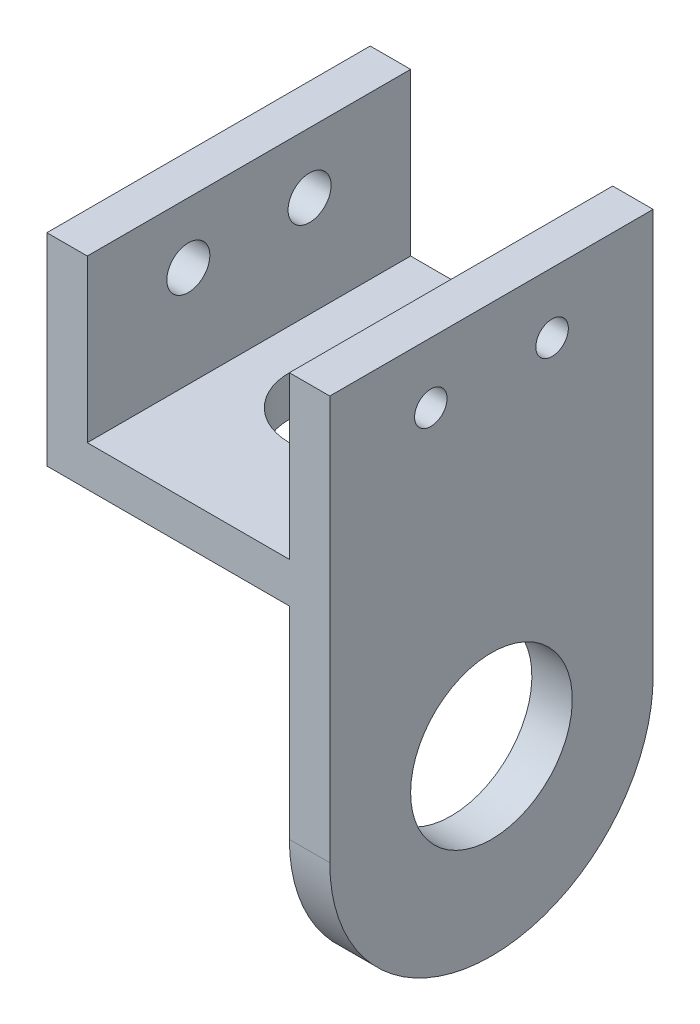
ISO-10303-21;
HEADER;
FILE_DESCRIPTION(('STEP AP214'),'2;1');
FILE_NAME('part.step','',(''),(''),'','','');
FILE_SCHEMA(('AUTOMOTIVE_DESIGN { 1 0 10303 214 1 1 1 1 }'));
ENDSEC;
DATA;
#1=APPLICATION_CONTEXT('core data for automotive mechanical design processes');
#2=APPLICATION_PROTOCOL_DEFINITION('international standard','automotive_design',2000,#1);
#3=PRODUCT_CONTEXT('',#1,'mechanical');
#4=PRODUCT('Part','Part','',(#3));
#5=PRODUCT_RELATED_PRODUCT_CATEGORY('part','',(#4));
#6=PRODUCT_DEFINITION_FORMATION('','',#4);
#7=PRODUCT_DEFINITION_CONTEXT('part definition',#1,'design');
#8=PRODUCT_DEFINITION('design','',#6,#7);
#9=PRODUCT_DEFINITION_SHAPE('','',#8);
#10=(LENGTH_UNIT() NAMED_UNIT(*) SI_UNIT(.MILLI.,.METRE.));
#11=(NAMED_UNIT(*) PLANE_ANGLE_UNIT() SI_UNIT($,.RADIAN.));
#12=(NAMED_UNIT(*) SI_UNIT($,.STERADIAN.) SOLID_ANGLE_UNIT());
#13=UNCERTAINTY_MEASURE_WITH_UNIT(LENGTH_MEASURE(1.E-05),#10,'distance_accuracy_value','');
#14=(GEOMETRIC_REPRESENTATION_CONTEXT(3) GLOBAL_UNCERTAINTY_ASSIGNED_CONTEXT((#13)) GLOBAL_UNIT_ASSIGNED_CONTEXT((#10,
#11,#12)) REPRESENTATION_CONTEXT('',''));
#15=CARTESIAN_POINT('',(0.,0.,0.));
#16=DIRECTION('',(0.,0.,1.));
#17=DIRECTION('',(1.,0.,0.));
#18=AXIS2_PLACEMENT_3D('',#15,#16,#17);
#19=CARTESIAN_POINT('',(0.,25.4,25.4));
#20=DIRECTION('',(1.,0.,0.));
#21=DIRECTION('',(0.,0.,-1.));
#22=AXIS2_PLACEMENT_3D('',#19,#20,#21);
#23=CYLINDRICAL_SURFACE('',#22,25.4);
#24=DIRECTION('',(-1.,0.,0.));
#25=VECTOR('',#24,1.);
#26=CARTESIAN_POINT('',(0.,25.4,50.8));
#27=LINE('',#26,#25);
#28=CARTESIAN_POINT('',(0.,25.4,50.8));
#29=VERTEX_POINT('',#28);
#30=CARTESIAN_POINT('',(6.35,25.4,50.8));
#31=VERTEX_POINT('',#30);
#32=EDGE_CURVE('E125',#29,#31,#27,.F.);
#33=ORIENTED_EDGE('',*,*,#32,.F.);
#34=CARTESIAN_POINT('',(0.,25.4,25.4));
#35=DIRECTION('',(1.,0.,0.));
#36=DIRECTION('',(0.,1.,0.));
#37=AXIS2_PLACEMENT_3D('',#34,#35,#36);
#38=CIRCLE('',#37,25.4);
#39=CARTESIAN_POINT('',(0.,25.4,0.));
#40=VERTEX_POINT('',#39);
#41=EDGE_CURVE('E53',#40,#29,#38,.F.);
#42=ORIENTED_EDGE('',*,*,#41,.F.);
#43=DIRECTION('',(1.,0.,0.));
#44=VECTOR('',#43,1.);
#45=CARTESIAN_POINT('',(0.,25.4,0.));
#46=LINE('',#45,#44);
#47=CARTESIAN_POINT('',(6.35,25.4,0.));
#48=VERTEX_POINT('',#47);
#49=EDGE_CURVE('E202',#48,#40,#46,.F.);
#50=ORIENTED_EDGE('',*,*,#49,.F.);
#51=CARTESIAN_POINT('',(6.35,25.4,25.4));
#52=DIRECTION('',(-1.,0.,0.));
#53=DIRECTION('',(0.,0.,1.));
#54=AXIS2_PLACEMENT_3D('',#51,#52,#53);
#55=CIRCLE('',#54,25.4);
#56=EDGE_CURVE('E11',#31,#48,#55,.F.);
#57=ORIENTED_EDGE('',*,*,#56,.F.);
#58=EDGE_LOOP('',(#33,#42,#50,#57));
#59=FACE_BOUND('',#58,.T.);
#60=ADVANCED_FACE('F45',(#59),#23,.T.);
#61=CARTESIAN_POINT('',(0.,57.15,50.8));
#62=DIRECTION('',(1.,0.,0.));
#63=DIRECTION('',(0.,1.,0.));
#64=AXIS2_PLACEMENT_3D('',#61,#62,#63);
#65=PLANE('',#64);
#66=CARTESIAN_POINT('',(0.,28.575,25.4));
#67=DIRECTION('',(-1.,0.,0.));
#68=DIRECTION('',(0.,-1.,0.));
#69=AXIS2_PLACEMENT_3D('',#66,#67,#68);
#70=CIRCLE('',#69,12.7);
#71=CARTESIAN_POINT('',(0.,15.875,25.4));
#72=VERTEX_POINT('',#71);
#73=EDGE_CURVE('E195',#72,#72,#70,.T.);
#74=ORIENTED_EDGE('',*,*,#73,.F.);
#75=EDGE_LOOP('',(#74));
#76=FACE_BOUND('',#75,.T.);
#77=DIRECTION('',(0.,-1.,0.));
#78=VECTOR('',#77,1.);
#79=CARTESIAN_POINT('',(0.,57.15,0.));
#80=LINE('',#79,#78);
#81=CARTESIAN_POINT('',(0.,57.15,0.));
#82=VERTEX_POINT('',#81);
#83=EDGE_CURVE('E156',#82,#40,#80,.T.);
#84=ORIENTED_EDGE('',*,*,#83,.T.);
#85=ORIENTED_EDGE('',*,*,#41,.T.);
#86=DIRECTION('',(0.,-1.,0.));
#87=VECTOR('',#86,1.);
#88=CARTESIAN_POINT('',(0.,57.15,50.8));
#89=LINE('',#88,#87);
#90=CARTESIAN_POINT('',(0.,57.15,50.8));
#91=VERTEX_POINT('',#90);
#92=EDGE_CURVE('E126',#91,#29,#89,.T.);
#93=ORIENTED_EDGE('',*,*,#92,.F.);
#94=DIRECTION('',(0.,0.,-1.));
#95=VECTOR('',#94,1.);
#96=CARTESIAN_POINT('',(0.,57.15,50.8));
#97=LINE('',#96,#95);
#98=EDGE_CURVE('E155',#91,#82,#97,.T.);
#99=ORIENTED_EDGE('',*,*,#98,.T.);
#100=EDGE_LOOP('',(#84,#85,#93,#99));
#101=FACE_BOUND('',#100,.T.);
#102=ADVANCED_FACE('F205',(#76,#101),#65,.F.);
#103=CARTESIAN_POINT('',(6.35,0.,50.8));
#104=DIRECTION('',(-1.,0.,0.));
#105=DIRECTION('',(0.,0.,1.));
#106=AXIS2_PLACEMENT_3D('',#103,#104,#105);
#107=PLANE('',#106);
#108=CARTESIAN_POINT('',(6.35,79.375,15.875));
#109=DIRECTION('',(-1.,0.,0.));
#110=DIRECTION('',(0.,0.,1.));
#111=AXIS2_PLACEMENT_3D('',#108,#109,#110);
#112=CIRCLE('',#111,2.55270000000001);
#113=CARTESIAN_POINT('',(6.35,79.375,18.4277));
#114=VERTEX_POINT('',#113);
#115=EDGE_CURVE('E218',#114,#114,#112,.T.);
#116=ORIENTED_EDGE('',*,*,#115,.T.);
#117=EDGE_LOOP('',(#116));
#118=FACE_BOUND('',#117,.T.);
#119=CARTESIAN_POINT('',(6.35,79.375,34.925));
#120=DIRECTION('',(-1.,0.,0.));
#121=DIRECTION('',(0.,0.,1.));
#122=AXIS2_PLACEMENT_3D('',#119,#120,#121);
#123=CIRCLE('',#122,2.55270000000001);
#124=CARTESIAN_POINT('',(6.35,79.375,37.4777));
#125=VERTEX_POINT('',#124);
#126=EDGE_CURVE('E212',#125,#125,#123,.T.);
#127=ORIENTED_EDGE('',*,*,#126,.T.);
#128=EDGE_LOOP('',(#127));
#129=FACE_BOUND('',#128,.T.);
#130=CARTESIAN_POINT('',(6.35,28.575,25.4));
#131=DIRECTION('',(-1.,0.,0.));
#132=DIRECTION('',(0.,0.,1.));
#133=AXIS2_PLACEMENT_3D('',#130,#131,#132);
#134=CIRCLE('',#133,12.7);
#135=CARTESIAN_POINT('',(6.35,28.575,38.1));
#136=VERTEX_POINT('',#135);
#137=EDGE_CURVE('E159',#136,#136,#134,.T.);
#138=ORIENTED_EDGE('',*,*,#137,.T.);
#139=EDGE_LOOP('',(#138));
#140=FACE_BOUND('',#139,.T.);
#141=DIRECTION('',(0.,1.,0.));
#142=VECTOR('',#141,1.);
#143=CARTESIAN_POINT('',(6.35,0.,50.8));
#144=LINE('',#143,#142);
#145=CARTESIAN_POINT('',(6.35,88.9,50.8));
#146=VERTEX_POINT('',#145);
#147=EDGE_CURVE('E118',#31,#146,#144,.T.);
#148=ORIENTED_EDGE('',*,*,#147,.F.);
#149=ORIENTED_EDGE('',*,*,#56,.T.);
#150=DIRECTION('',(0.,1.,0.));
#151=VECTOR('',#150,1.);
#152=CARTESIAN_POINT('',(6.35,0.,0.));
#153=LINE('',#152,#151);
#154=CARTESIAN_POINT('',(6.35,88.9,0.));
#155=VERTEX_POINT('',#154);
#156=EDGE_CURVE('E132',#48,#155,#153,.T.);
#157=ORIENTED_EDGE('',*,*,#156,.T.);
#158=DIRECTION('',(0.,0.,-1.));
#159=VECTOR('',#158,1.);
#160=CARTESIAN_POINT('',(6.35,88.9,50.8));
#161=LINE('',#160,#159);
#162=EDGE_CURVE('E129',#146,#155,#161,.T.);
#163=ORIENTED_EDGE('',*,*,#162,.F.);
#164=EDGE_LOOP('',(#148,#149,#157,#163));
#165=FACE_BOUND('',#164,.T.);
#166=ADVANCED_FACE('F130',(#118,#129,#140,#165),#107,.F.);
#167=CARTESIAN_POINT('',(6.35,88.9,50.8));
#168=DIRECTION('',(0.,-1.,0.));
#169=DIRECTION('',(0.,0.,-1.));
#170=AXIS2_PLACEMENT_3D('',#167,#168,#169);
#171=PLANE('',#170);
#172=DIRECTION('',(-1.,0.,0.));
#173=VECTOR('',#172,1.);
#174=CARTESIAN_POINT('',(6.35,88.9,0.));
#175=LINE('',#174,#173);
#176=CARTESIAN_POINT('',(0.,88.9,0.));
#177=VERTEX_POINT('',#176);
#178=EDGE_CURVE('E161',#155,#177,#175,.T.);
#179=ORIENTED_EDGE('',*,*,#178,.T.);
#180=DIRECTION('',(0.,0.,-1.));
#181=VECTOR('',#180,1.);
#182=CARTESIAN_POINT('',(0.,88.9,50.8));
#183=LINE('',#182,#181);
#184=CARTESIAN_POINT('',(0.,88.9,50.8));
#185=VERTEX_POINT('',#184);
#186=EDGE_CURVE('E135',#185,#177,#183,.T.);
#187=ORIENTED_EDGE('',*,*,#186,.F.);
#188=DIRECTION('',(-1.,0.,0.));
#189=VECTOR('',#188,1.);
#190=CARTESIAN_POINT('',(6.35,88.9,50.8));
#191=LINE('',#190,#189);
#192=EDGE_CURVE('E123',#146,#185,#191,.T.);
#193=ORIENTED_EDGE('',*,*,#192,.F.);
#194=ORIENTED_EDGE('',*,*,#162,.T.);
#195=EDGE_LOOP('',(#179,#187,#193,#194));
#196=FACE_BOUND('',#195,.T.);
#197=ADVANCED_FACE('F137',(#196),#171,.F.);
#198=CARTESIAN_POINT('',(0.,88.9,50.8));
#199=DIRECTION('',(1.,0.,0.));
#200=DIRECTION('',(0.,1.,0.));
#201=AXIS2_PLACEMENT_3D('',#198,#199,#200);
#202=PLANE('',#201);
#203=CARTESIAN_POINT('',(0.,79.375,15.875));
#204=DIRECTION('',(-1.,0.,0.));
#205=DIRECTION('',(0.,0.,1.));
#206=AXIS2_PLACEMENT_3D('',#203,#204,#205);
#207=CIRCLE('',#206,2.55270000000001);
#208=CARTESIAN_POINT('',(0.,79.375,18.4277));
#209=VERTEX_POINT('',#208);
#210=EDGE_CURVE('E221',#209,#209,#207,.T.);
#211=ORIENTED_EDGE('',*,*,#210,.F.);
#212=EDGE_LOOP('',(#211));
#213=FACE_BOUND('',#212,.T.);
#214=CARTESIAN_POINT('',(0.,79.375,34.925));
#215=DIRECTION('',(-1.,0.,0.));
#216=DIRECTION('',(0.,0.,1.));
#217=AXIS2_PLACEMENT_3D('',#214,#215,#216);
#218=CIRCLE('',#217,2.55270000000001);
#219=CARTESIAN_POINT('',(0.,79.375,37.4777));
#220=VERTEX_POINT('',#219);
#221=EDGE_CURVE('E215',#220,#220,#218,.T.);
#222=ORIENTED_EDGE('',*,*,#221,.F.);
#223=EDGE_LOOP('',(#222));
#224=FACE_BOUND('',#223,.T.);
#225=DIRECTION('',(0.,-1.,0.));
#226=VECTOR('',#225,1.);
#227=CARTESIAN_POINT('',(0.,88.9,0.));
#228=LINE('',#227,#226);
#229=CARTESIAN_POINT('',(0.,63.5,0.));
#230=VERTEX_POINT('',#229);
#231=EDGE_CURVE('E163',#177,#230,#228,.T.);
#232=ORIENTED_EDGE('',*,*,#231,.T.);
#233=DIRECTION('',(0.,0.,-1.));
#234=VECTOR('',#233,1.);
#235=CARTESIAN_POINT('',(0.,63.5,50.8));
#236=LINE('',#235,#234);
#237=CARTESIAN_POINT('',(0.,63.5,50.8));
#238=VERTEX_POINT('',#237);
#239=EDGE_CURVE('E189',#238,#230,#236,.T.);
#240=ORIENTED_EDGE('',*,*,#239,.F.);
#241=DIRECTION('',(0.,-1.,0.));
#242=VECTOR('',#241,1.);
#243=CARTESIAN_POINT('',(0.,88.9,50.8));
#244=LINE('',#243,#242);
#245=EDGE_CURVE('E140',#185,#238,#244,.T.);
#246=ORIENTED_EDGE('',*,*,#245,.F.);
#247=ORIENTED_EDGE('',*,*,#186,.T.);
#248=EDGE_LOOP('',(#232,#240,#246,#247));
#249=FACE_BOUND('',#248,.T.);
#250=ADVANCED_FACE('F245',(#213,#224,#249),#202,.F.);
#251=CARTESIAN_POINT('',(0.,63.5,50.8));
#252=DIRECTION('',(0.,-1.,0.));
#253=DIRECTION('',(1.,0.,0.));
#254=AXIS2_PLACEMENT_3D('',#251,#252,#253);
#255=PLANE('',#254);
#256=CARTESIAN_POINT('',(-15.875,63.5,25.4));
#257=DIRECTION('',(0.,1.,0.));
#258=DIRECTION('',(0.,0.,1.));
#259=AXIS2_PLACEMENT_3D('',#256,#257,#258);
#260=CIRCLE('',#259,9.525);
#261=CARTESIAN_POINT('',(-15.875,63.5,34.925));
#262=VERTEX_POINT('',#261);
#263=EDGE_CURVE('E200',#262,#262,#260,.T.);
#264=ORIENTED_EDGE('',*,*,#263,.F.);
#265=EDGE_LOOP('',(#264));
#266=FACE_BOUND('',#265,.T.);
#267=DIRECTION('',(-1.,0.,0.));
#268=VECTOR('',#267,1.);
#269=CARTESIAN_POINT('',(0.,63.5,0.));
#270=LINE('',#269,#268);
#271=CARTESIAN_POINT('',(-31.75,63.5,0.));
#272=VERTEX_POINT('',#271);
#273=EDGE_CURVE('E165',#230,#272,#270,.T.);
#274=ORIENTED_EDGE('',*,*,#273,.T.);
#275=DIRECTION('',(0.,0.,-1.));
#276=VECTOR('',#275,1.);
#277=CARTESIAN_POINT('',(-31.75,63.5,50.8));
#278=LINE('',#277,#276);
#279=CARTESIAN_POINT('',(-31.75,63.5,50.8));
#280=VERTEX_POINT('',#279);
#281=EDGE_CURVE('E186',#280,#272,#278,.T.);
#282=ORIENTED_EDGE('',*,*,#281,.F.);
#283=DIRECTION('',(-1.,0.,0.));
#284=VECTOR('',#283,1.);
#285=CARTESIAN_POINT('',(0.,63.5,50.8));
#286=LINE('',#285,#284);
#287=EDGE_CURVE('E142',#238,#280,#286,.T.);
#288=ORIENTED_EDGE('',*,*,#287,.F.);
#289=ORIENTED_EDGE('',*,*,#239,.T.);
#290=EDGE_LOOP('',(#274,#282,#288,#289));
#291=FACE_BOUND('',#290,.T.);
#292=ADVANCED_FACE('F241',(#266,#291),#255,.F.);
#293=CARTESIAN_POINT('',(-31.75,63.5,50.8));
#294=DIRECTION('',(-1.,0.,0.));
#295=DIRECTION('',(0.,0.,1.));
#296=AXIS2_PLACEMENT_3D('',#293,#294,#295);
#297=PLANE('',#296);
#298=CARTESIAN_POINT('',(-31.75,79.375,15.875));
#299=DIRECTION('',(-1.,0.,0.));
#300=DIRECTION('',(0.,0.,1.));
#301=AXIS2_PLACEMENT_3D('',#298,#299,#300);
#302=CIRCLE('',#301,3.3782);
#303=CARTESIAN_POINT('',(-31.75,79.375,19.2532));
#304=VERTEX_POINT('',#303);
#305=EDGE_CURVE('E224',#304,#304,#302,.T.);
#306=ORIENTED_EDGE('',*,*,#305,.T.);
#307=EDGE_LOOP('',(#306));
#308=FACE_BOUND('',#307,.T.);
#309=CARTESIAN_POINT('',(-31.75,79.375,34.925));
#310=DIRECTION('',(-1.,0.,0.));
#311=DIRECTION('',(0.,0.,1.));
#312=AXIS2_PLACEMENT_3D('',#309,#310,#311);
#313=CIRCLE('',#312,3.3782);
#314=CARTESIAN_POINT('',(-31.75,79.375,38.3032));
#315=VERTEX_POINT('',#314);
#316=EDGE_CURVE('E227',#315,#315,#313,.T.);
#317=ORIENTED_EDGE('',*,*,#316,.T.);
#318=EDGE_LOOP('',(#317));
#319=FACE_BOUND('',#318,.T.);
#320=DIRECTION('',(0.,1.,0.));
#321=VECTOR('',#320,1.);
#322=CARTESIAN_POINT('',(-31.75,63.5,0.));
#323=LINE('',#322,#321);
#324=CARTESIAN_POINT('',(-31.75,88.9,0.));
#325=VERTEX_POINT('',#324);
#326=EDGE_CURVE('E167',#272,#325,#323,.T.);
#327=ORIENTED_EDGE('',*,*,#326,.T.);
#328=DIRECTION('',(0.,0.,-1.));
#329=VECTOR('',#328,1.);
#330=CARTESIAN_POINT('',(-31.75,88.9,50.8));
#331=LINE('',#330,#329);
#332=CARTESIAN_POINT('',(-31.75,88.9,50.8));
#333=VERTEX_POINT('',#332);
#334=EDGE_CURVE('E183',#333,#325,#331,.T.);
#335=ORIENTED_EDGE('',*,*,#334,.F.);
#336=DIRECTION('',(0.,1.,0.));
#337=VECTOR('',#336,1.);
#338=CARTESIAN_POINT('',(-31.75,63.5,50.8));
#339=LINE('',#338,#337);
#340=EDGE_CURVE('E147',#280,#333,#339,.T.);
#341=ORIENTED_EDGE('',*,*,#340,.F.);
#342=ORIENTED_EDGE('',*,*,#281,.T.);
#343=EDGE_LOOP('',(#327,#335,#341,#342));
#344=FACE_BOUND('',#343,.T.);
#345=ADVANCED_FACE('F244',(#308,#319,#344),#297,.F.);
#346=CARTESIAN_POINT('',(-31.75,88.9,50.8));
#347=DIRECTION('',(0.,-1.,0.));
#348=DIRECTION('',(0.,0.,-1.));
#349=AXIS2_PLACEMENT_3D('',#346,#347,#348);
#350=PLANE('',#349);
#351=DIRECTION('',(-1.,0.,0.));
#352=VECTOR('',#351,1.);
#353=CARTESIAN_POINT('',(-31.75,88.9,0.));
#354=LINE('',#353,#352);
#355=CARTESIAN_POINT('',(-38.1,88.9,0.));
#356=VERTEX_POINT('',#355);
#357=EDGE_CURVE('E169',#325,#356,#354,.T.);
#358=ORIENTED_EDGE('',*,*,#357,.T.);
#359=DIRECTION('',(0.,0.,-1.));
#360=VECTOR('',#359,1.);
#361=CARTESIAN_POINT('',(-38.1,88.9,50.8));
#362=LINE('',#361,#360);
#363=CARTESIAN_POINT('',(-38.1,88.9,50.8));
#364=VERTEX_POINT('',#363);
#365=EDGE_CURVE('E180',#364,#356,#362,.T.);
#366=ORIENTED_EDGE('',*,*,#365,.F.);
#367=DIRECTION('',(-1.,0.,0.));
#368=VECTOR('',#367,1.);
#369=CARTESIAN_POINT('',(-31.75,88.9,50.8));
#370=LINE('',#369,#368);
#371=EDGE_CURVE('E149',#333,#364,#370,.T.);
#372=ORIENTED_EDGE('',*,*,#371,.F.);
#373=ORIENTED_EDGE('',*,*,#334,.T.);
#374=EDGE_LOOP('',(#358,#366,#372,#373));
#375=FACE_BOUND('',#374,.T.);
#376=ADVANCED_FACE('F263',(#375),#350,.F.);
#377=CARTESIAN_POINT('',(-38.1,88.9,50.8));
#378=DIRECTION('',(1.,0.,0.));
#379=DIRECTION('',(0.,1.,0.));
#380=AXIS2_PLACEMENT_3D('',#377,#378,#379);
#381=PLANE('',#380);
#382=CARTESIAN_POINT('',(-38.1,79.375,15.875));
#383=DIRECTION('',(-1.,0.,0.));
#384=DIRECTION('',(0.,0.,1.));
#385=AXIS2_PLACEMENT_3D('',#382,#383,#384);
#386=CIRCLE('',#385,3.3782);
#387=CARTESIAN_POINT('',(-38.1,79.375,19.2532));
#388=VERTEX_POINT('',#387);
#389=EDGE_CURVE('E230',#388,#388,#386,.T.);
#390=ORIENTED_EDGE('',*,*,#389,.F.);
#391=EDGE_LOOP('',(#390));
#392=FACE_BOUND('',#391,.T.);
#393=CARTESIAN_POINT('',(-38.1,79.375,34.925));
#394=DIRECTION('',(-1.,0.,0.));
#395=DIRECTION('',(0.,0.,1.));
#396=AXIS2_PLACEMENT_3D('',#393,#394,#395);
#397=CIRCLE('',#396,3.3782);
#398=CARTESIAN_POINT('',(-38.1,79.375,38.3032));
#399=VERTEX_POINT('',#398);
#400=EDGE_CURVE('E199',#399,#399,#397,.T.);
#401=ORIENTED_EDGE('',*,*,#400,.F.);
#402=EDGE_LOOP('',(#401));
#403=FACE_BOUND('',#402,.T.);
#404=DIRECTION('',(0.,-1.,0.));
#405=VECTOR('',#404,1.);
#406=CARTESIAN_POINT('',(-38.1,88.9,0.));
#407=LINE('',#406,#405);
#408=CARTESIAN_POINT('',(-38.1,57.15,0.));
#409=VERTEX_POINT('',#408);
#410=EDGE_CURVE('E171',#356,#409,#407,.T.);
#411=ORIENTED_EDGE('',*,*,#410,.T.);
#412=DIRECTION('',(0.,0.,-1.));
#413=VECTOR('',#412,1.);
#414=CARTESIAN_POINT('',(-38.1,57.15,50.8));
#415=LINE('',#414,#413);
#416=CARTESIAN_POINT('',(-38.1,57.15,50.8));
#417=VERTEX_POINT('',#416);
#418=EDGE_CURVE('E177',#417,#409,#415,.T.);
#419=ORIENTED_EDGE('',*,*,#418,.F.);
#420=DIRECTION('',(0.,-1.,0.));
#421=VECTOR('',#420,1.);
#422=CARTESIAN_POINT('',(-38.1,88.9,50.8));
#423=LINE('',#422,#421);
#424=EDGE_CURVE('E151',#364,#417,#423,.T.);
#425=ORIENTED_EDGE('',*,*,#424,.F.);
#426=ORIENTED_EDGE('',*,*,#365,.T.);
#427=EDGE_LOOP('',(#411,#419,#425,#426));
#428=FACE_BOUND('',#427,.T.);
#429=ADVANCED_FACE('F267',(#392,#403,#428),#381,.F.);
#430=CARTESIAN_POINT('',(-38.1,57.15,50.8));
#431=DIRECTION('',(0.,1.,0.));
#432=DIRECTION('',(-1.,0.,0.));
#433=AXIS2_PLACEMENT_3D('',#430,#431,#432);
#434=PLANE('',#433);
#435=CARTESIAN_POINT('',(-15.875,57.15,25.4));
#436=DIRECTION('',(0.,1.,0.));
#437=DIRECTION('',(-1.,0.,0.));
#438=AXIS2_PLACEMENT_3D('',#435,#436,#437);
#439=CIRCLE('',#438,9.525);
#440=CARTESIAN_POINT('',(-25.4,57.15,25.4));
#441=VERTEX_POINT('',#440);
#442=EDGE_CURVE('E196',#441,#441,#439,.T.);
#443=ORIENTED_EDGE('',*,*,#442,.T.);
#444=EDGE_LOOP('',(#443));
#445=FACE_BOUND('',#444,.T.);
#446=DIRECTION('',(1.,0.,0.));
#447=VECTOR('',#446,1.);
#448=CARTESIAN_POINT('',(-38.1,57.15,0.));
#449=LINE('',#448,#447);
#450=EDGE_CURVE('E173',#409,#82,#449,.T.);
#451=ORIENTED_EDGE('',*,*,#450,.T.);
#452=ORIENTED_EDGE('',*,*,#98,.F.);
#453=DIRECTION('',(1.,0.,0.));
#454=VECTOR('',#453,1.);
#455=CARTESIAN_POINT('',(-38.1,57.15,50.8));
#456=LINE('',#455,#454);
#457=EDGE_CURVE('E153',#417,#91,#456,.T.);
#458=ORIENTED_EDGE('',*,*,#457,.F.);
#459=ORIENTED_EDGE('',*,*,#418,.T.);
#460=EDGE_LOOP('',(#451,#452,#458,#459));
#461=FACE_BOUND('',#460,.T.);
#462=ADVANCED_FACE('F271',(#445,#461),#434,.F.);
#463=CARTESIAN_POINT('',(0.,0.,50.8));
#464=DIRECTION('',(0.,0.,1.));
#465=DIRECTION('',(1.,0.,0.));
#466=AXIS2_PLACEMENT_3D('',#463,#464,#465);
#467=PLANE('',#466);
#468=ORIENTED_EDGE('',*,*,#92,.T.);
#469=ORIENTED_EDGE('',*,*,#32,.T.);
#470=ORIENTED_EDGE('',*,*,#147,.T.);
#471=ORIENTED_EDGE('',*,*,#192,.T.);
#472=ORIENTED_EDGE('',*,*,#245,.T.);
#473=ORIENTED_EDGE('',*,*,#287,.T.);
#474=ORIENTED_EDGE('',*,*,#340,.T.);
#475=ORIENTED_EDGE('',*,*,#371,.T.);
#476=ORIENTED_EDGE('',*,*,#424,.T.);
#477=ORIENTED_EDGE('',*,*,#457,.T.);
#478=EDGE_LOOP('',(#468,#469,#470,#471,#472,#473,#474,#475,#476,#477));
#479=FACE_BOUND('',#478,.T.);
#480=ADVANCED_FACE('F121',(#479),#467,.T.);
#481=CARTESIAN_POINT('',(0.,0.,0.));
#482=DIRECTION('',(0.,0.,1.));
#483=DIRECTION('',(1.,0.,0.));
#484=AXIS2_PLACEMENT_3D('',#481,#482,#483);
#485=PLANE('',#484);
#486=ORIENTED_EDGE('',*,*,#156,.F.);
#487=ORIENTED_EDGE('',*,*,#49,.T.);
#488=ORIENTED_EDGE('',*,*,#83,.F.);
#489=ORIENTED_EDGE('',*,*,#450,.F.);
#490=ORIENTED_EDGE('',*,*,#410,.F.);
#491=ORIENTED_EDGE('',*,*,#357,.F.);
#492=ORIENTED_EDGE('',*,*,#326,.F.);
#493=ORIENTED_EDGE('',*,*,#273,.F.);
#494=ORIENTED_EDGE('',*,*,#231,.F.);
#495=ORIENTED_EDGE('',*,*,#178,.F.);
#496=EDGE_LOOP('',(#486,#487,#488,#489,#490,#491,#492,#493,#494,#495));
#497=FACE_BOUND('',#496,.T.);
#498=ADVANCED_FACE('F258',(#497),#485,.F.);
#499=CARTESIAN_POINT('',(44.45,28.575,25.4));
#500=DIRECTION('',(-1.,0.,0.));
#501=DIRECTION('',(0.,-1.,0.));
#502=AXIS2_PLACEMENT_3D('',#499,#500,#501);
#503=CYLINDRICAL_SURFACE('',#502,12.7);
#504=ORIENTED_EDGE('',*,*,#73,.T.);
#505=EDGE_LOOP('',(#504));
#506=FACE_BOUND('',#505,.T.);
#507=ORIENTED_EDGE('',*,*,#137,.F.);
#508=EDGE_LOOP('',(#507));
#509=FACE_BOUND('',#508,.T.);
#510=ADVANCED_FACE('F397',(#506,#509),#503,.F.);
#511=CARTESIAN_POINT('',(0.,79.375,34.925));
#512=DIRECTION('',(-1.,0.,0.));
#513=DIRECTION('',(0.,0.,1.));
#514=AXIS2_PLACEMENT_3D('',#511,#512,#513);
#515=CYLINDRICAL_SURFACE('',#514,2.55270000000001);
#516=ORIENTED_EDGE('',*,*,#126,.F.);
#517=EDGE_LOOP('',(#516));
#518=FACE_BOUND('',#517,.T.);
#519=ORIENTED_EDGE('',*,*,#221,.T.);
#520=EDGE_LOOP('',(#519));
#521=FACE_BOUND('',#520,.T.);
#522=ADVANCED_FACE('F406',(#518,#521),#515,.F.);
#523=CARTESIAN_POINT('',(0.,79.375,15.875));
#524=DIRECTION('',(-1.,0.,0.));
#525=DIRECTION('',(0.,0.,1.));
#526=AXIS2_PLACEMENT_3D('',#523,#524,#525);
#527=CYLINDRICAL_SURFACE('',#526,2.55270000000001);
#528=ORIENTED_EDGE('',*,*,#115,.F.);
#529=EDGE_LOOP('',(#528));
#530=FACE_BOUND('',#529,.T.);
#531=ORIENTED_EDGE('',*,*,#210,.T.);
#532=EDGE_LOOP('',(#531));
#533=FACE_BOUND('',#532,.T.);
#534=ADVANCED_FACE('F330',(#530,#533),#527,.F.);
#535=CARTESIAN_POINT('',(-29.21,79.375,34.925));
#536=DIRECTION('',(-1.,0.,0.));
#537=DIRECTION('',(0.,0.,1.));
#538=AXIS2_PLACEMENT_3D('',#535,#536,#537);
#539=CYLINDRICAL_SURFACE('',#538,3.3782);
#540=ORIENTED_EDGE('',*,*,#400,.T.);
#541=EDGE_LOOP('',(#540));
#542=FACE_BOUND('',#541,.T.);
#543=ORIENTED_EDGE('',*,*,#316,.F.);
#544=EDGE_LOOP('',(#543));
#545=FACE_BOUND('',#544,.T.);
#546=ADVANCED_FACE('F324',(#542,#545),#539,.F.);
#547=CARTESIAN_POINT('',(-29.21,79.375,15.875));
#548=DIRECTION('',(-1.,0.,0.));
#549=DIRECTION('',(0.,0.,1.));
#550=AXIS2_PLACEMENT_3D('',#547,#548,#549);
#551=CYLINDRICAL_SURFACE('',#550,3.3782);
#552=ORIENTED_EDGE('',*,*,#389,.T.);
#553=EDGE_LOOP('',(#552));
#554=FACE_BOUND('',#553,.T.);
#555=ORIENTED_EDGE('',*,*,#305,.F.);
#556=EDGE_LOOP('',(#555));
#557=FACE_BOUND('',#556,.T.);
#558=ADVANCED_FACE('F329',(#554,#557),#551,.F.);
#559=CARTESIAN_POINT('',(-15.875,54.61,25.4));
#560=DIRECTION('',(0.,1.,0.));
#561=DIRECTION('',(0.,0.,1.));
#562=AXIS2_PLACEMENT_3D('',#559,#560,#561);
#563=CYLINDRICAL_SURFACE('',#562,9.525);
#564=ORIENTED_EDGE('',*,*,#263,.T.);
#565=EDGE_LOOP('',(#564));
#566=FACE_BOUND('',#565,.T.);
#567=ORIENTED_EDGE('',*,*,#442,.F.);
#568=EDGE_LOOP('',(#567));
#569=FACE_BOUND('',#568,.T.);
#570=ADVANCED_FACE('F238',(#566,#569),#563,.F.);
#571=CLOSED_SHELL('',(#60,#102,#166,#197,#250,#292,#345,#376,#429,#462,#480,#498,#510,#522,#534,
#546,#558,#570));
#572=MANIFOLD_SOLID_BREP('B2',#571);
#573=ADVANCED_BREP_SHAPE_REPRESENTATION('',(#18,#572),#14);
#574=SHAPE_DEFINITION_REPRESENTATION(#9,#573);
ENDSEC;
END-ISO-10303-21;
